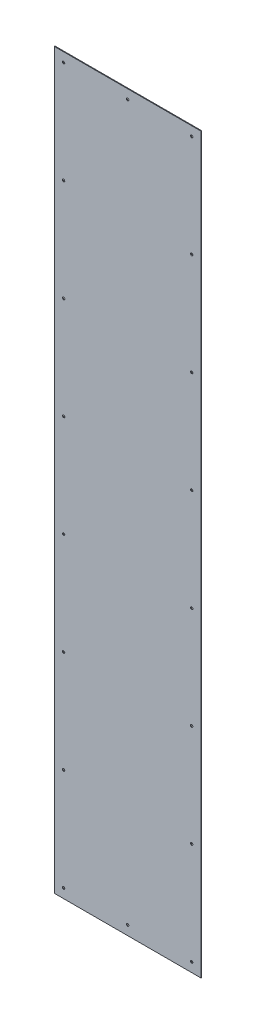
ISO-10303-21;
HEADER;
FILE_DESCRIPTION(('STEP AP214'),'2;1');
FILE_NAME('part.step','',(''),(''),'','','');
FILE_SCHEMA(('AUTOMOTIVE_DESIGN { 1 0 10303 214 1 1 1 1 }'));
ENDSEC;
DATA;
#1=APPLICATION_CONTEXT('core data for automotive mechanical design processes');
#2=APPLICATION_PROTOCOL_DEFINITION('international standard','automotive_design',2000,#1);
#3=PRODUCT_CONTEXT('',#1,'mechanical');
#4=PRODUCT('Part','Part','',(#3));
#5=PRODUCT_RELATED_PRODUCT_CATEGORY('part','',(#4));
#6=PRODUCT_DEFINITION_FORMATION('','',#4);
#7=PRODUCT_DEFINITION_CONTEXT('part definition',#1,'design');
#8=PRODUCT_DEFINITION('design','',#6,#7);
#9=PRODUCT_DEFINITION_SHAPE('','',#8);
#10=(LENGTH_UNIT() NAMED_UNIT(*) SI_UNIT(.MILLI.,.METRE.));
#11=(NAMED_UNIT(*) PLANE_ANGLE_UNIT() SI_UNIT($,.RADIAN.));
#12=(NAMED_UNIT(*) SI_UNIT($,.STERADIAN.) SOLID_ANGLE_UNIT());
#13=UNCERTAINTY_MEASURE_WITH_UNIT(LENGTH_MEASURE(1.E-05),#10,'distance_accuracy_value','');
#14=(GEOMETRIC_REPRESENTATION_CONTEXT(3) GLOBAL_UNCERTAINTY_ASSIGNED_CONTEXT((#13)) GLOBAL_UNIT_ASSIGNED_CONTEXT((#10,
#11,#12)) REPRESENTATION_CONTEXT('',''));
#15=CARTESIAN_POINT('',(0.,0.,0.));
#16=DIRECTION('',(0.,0.,1.));
#17=DIRECTION('',(1.,0.,0.));
#18=AXIS2_PLACEMENT_3D('',#15,#16,#17);
#19=CARTESIAN_POINT('',(0.,0.,1.9));
#20=DIRECTION('',(0.,0.,1.));
#21=DIRECTION('',(1.,0.,0.));
#22=AXIS2_PLACEMENT_3D('',#19,#20,#21);
#23=PLANE('',#22);
#24=CARTESIAN_POINT('',(174.599999999992,417.7,1.9));
#25=DIRECTION('',(0.,0.,1.));
#26=DIRECTION('',(1.,0.,0.));
#27=AXIS2_PLACEMENT_3D('',#24,#25,#26);
#28=CIRCLE('',#27,3.175);
#29=CARTESIAN_POINT('',(177.774999999992,417.7,1.9));
#30=VERTEX_POINT('',#29);
#31=EDGE_CURVE('E201',#30,#30,#28,.F.);
#32=ORIENTED_EDGE('',*,*,#31,.T.);
#33=EDGE_LOOP('',(#32));
#34=FACE_BOUND('',#33,.T.);
#35=CARTESIAN_POINT('',(174.599999999985,-139.2,1.9));
#36=DIRECTION('',(0.,0.,1.));
#37=DIRECTION('',(1.,0.,0.));
#38=AXIS2_PLACEMENT_3D('',#35,#36,#37);
#39=CIRCLE('',#38,3.175);
#40=CARTESIAN_POINT('',(177.774999999985,-139.2,1.9));
#41=VERTEX_POINT('',#40);
#42=EDGE_CURVE('E207',#41,#41,#39,.F.);
#43=ORIENTED_EDGE('',*,*,#42,.T.);
#44=EDGE_LOOP('',(#43));
#45=FACE_BOUND('',#44,.T.);
#46=CARTESIAN_POINT('',(174.599999999977,-696.1,1.9));
#47=DIRECTION('',(0.,0.,1.));
#48=DIRECTION('',(1.,0.,0.));
#49=AXIS2_PLACEMENT_3D('',#46,#47,#48);
#50=CIRCLE('',#49,3.175);
#51=CARTESIAN_POINT('',(177.774999999977,-696.1,1.9));
#52=VERTEX_POINT('',#51);
#53=EDGE_CURVE('E213',#52,#52,#50,.F.);
#54=ORIENTED_EDGE('',*,*,#53,.T.);
#55=EDGE_LOOP('',(#54));
#56=FACE_BOUND('',#55,.T.);
#57=CARTESIAN_POINT('',(0.,-974.6,1.9));
#58=DIRECTION('',(0.,0.,1.));
#59=DIRECTION('',(1.,0.,0.));
#60=AXIS2_PLACEMENT_3D('',#57,#58,#59);
#61=CIRCLE('',#60,3.175);
#62=CARTESIAN_POINT('',(3.175,-974.6,1.9));
#63=VERTEX_POINT('',#62);
#64=EDGE_CURVE('E219',#63,#63,#61,.F.);
#65=ORIENTED_EDGE('',*,*,#64,.T.);
#66=EDGE_LOOP('',(#65));
#67=FACE_BOUND('',#66,.T.);
#68=DIRECTION('',(0.,1.,0.));
#69=VECTOR('',#68,1.);
#70=CARTESIAN_POINT('',(200.,1000.,1.9));
#71=LINE('',#70,#69);
#72=CARTESIAN_POINT('',(200.,-1000.,1.9));
#73=VERTEX_POINT('',#72);
#74=CARTESIAN_POINT('',(200.,1000.,1.9));
#75=VERTEX_POINT('',#74);
#76=EDGE_CURVE('E92',#73,#75,#71,.T.);
#77=ORIENTED_EDGE('',*,*,#76,.T.);
#78=DIRECTION('',(-1.,0.,0.));
#79=VECTOR('',#78,1.);
#80=CARTESIAN_POINT('',(-200.,1000.,1.9));
#81=LINE('',#80,#79);
#82=CARTESIAN_POINT('',(-200.,1000.,1.9));
#83=VERTEX_POINT('',#82);
#84=EDGE_CURVE('E87',#75,#83,#81,.T.);
#85=ORIENTED_EDGE('',*,*,#84,.T.);
#86=DIRECTION('',(0.,-1.,0.));
#87=VECTOR('',#86,1.);
#88=CARTESIAN_POINT('',(-200.,1000.,1.9));
#89=LINE('',#88,#87);
#90=CARTESIAN_POINT('',(-200.,-1000.,1.9));
#91=VERTEX_POINT('',#90);
#92=EDGE_CURVE('E90',#83,#91,#89,.T.);
#93=ORIENTED_EDGE('',*,*,#92,.T.);
#94=DIRECTION('',(1.,0.,0.));
#95=VECTOR('',#94,1.);
#96=CARTESIAN_POINT('',(-200.,-1000.,1.9));
#97=LINE('',#96,#95);
#98=EDGE_CURVE('E57',#91,#73,#97,.T.);
#99=ORIENTED_EDGE('',*,*,#98,.T.);
#100=EDGE_LOOP('',(#77,#85,#93,#99));
#101=FACE_BOUND('',#100,.T.);
#102=CARTESIAN_POINT('',(-174.6,974.6,1.9));
#103=DIRECTION('',(0.,0.,1.));
#104=DIRECTION('',(1.,0.,0.));
#105=AXIS2_PLACEMENT_3D('',#102,#103,#104);
#106=CIRCLE('',#105,3.175);
#107=CARTESIAN_POINT('',(-171.425,974.6,1.9));
#108=VERTEX_POINT('',#107);
#109=EDGE_CURVE('E116',#108,#108,#106,.T.);
#110=ORIENTED_EDGE('',*,*,#109,.F.);
#111=EDGE_LOOP('',(#110));
#112=FACE_BOUND('',#111,.T.);
#113=CARTESIAN_POINT('',(0.,974.6,1.9));
#114=DIRECTION('',(0.,0.,1.));
#115=DIRECTION('',(1.,0.,0.));
#116=AXIS2_PLACEMENT_3D('',#113,#114,#115);
#117=CIRCLE('',#116,3.175);
#118=CARTESIAN_POINT('',(3.175,974.6,1.9));
#119=VERTEX_POINT('',#118);
#120=EDGE_CURVE('E121',#119,#119,#117,.T.);
#121=ORIENTED_EDGE('',*,*,#120,.F.);
#122=EDGE_LOOP('',(#121));
#123=FACE_BOUND('',#122,.T.);
#124=CARTESIAN_POINT('',(174.6,974.6,1.9));
#125=DIRECTION('',(0.,0.,1.));
#126=DIRECTION('',(1.,0.,0.));
#127=AXIS2_PLACEMENT_3D('',#124,#125,#126);
#128=CIRCLE('',#127,3.175);
#129=CARTESIAN_POINT('',(177.775,974.6,1.9));
#130=VERTEX_POINT('',#129);
#131=EDGE_CURVE('E193',#130,#130,#128,.T.);
#132=ORIENTED_EDGE('',*,*,#131,.F.);
#133=EDGE_LOOP('',(#132));
#134=FACE_BOUND('',#133,.T.);
#135=CARTESIAN_POINT('',(-174.599999999996,696.15,1.9));
#136=DIRECTION('',(0.,0.,1.));
#137=DIRECTION('',(1.,0.,0.));
#138=AXIS2_PLACEMENT_3D('',#135,#136,#137);
#139=CIRCLE('',#138,3.175);
#140=CARTESIAN_POINT('',(-171.424999999996,696.15,1.9));
#141=VERTEX_POINT('',#140);
#142=EDGE_CURVE('E190',#141,#141,#139,.T.);
#143=ORIENTED_EDGE('',*,*,#142,.F.);
#144=EDGE_LOOP('',(#143));
#145=FACE_BOUND('',#144,.T.);
#146=CARTESIAN_POINT('',(-174.599999999992,417.7,1.9));
#147=DIRECTION('',(0.,0.,1.));
#148=DIRECTION('',(1.,0.,0.));
#149=AXIS2_PLACEMENT_3D('',#146,#147,#148);
#150=CIRCLE('',#149,3.175);
#151=CARTESIAN_POINT('',(-171.424999999992,417.7,1.9));
#152=VERTEX_POINT('',#151);
#153=EDGE_CURVE('E187',#152,#152,#150,.T.);
#154=ORIENTED_EDGE('',*,*,#153,.F.);
#155=EDGE_LOOP('',(#154));
#156=FACE_BOUND('',#155,.T.);
#157=CARTESIAN_POINT('',(-174.599999999988,139.25,1.9));
#158=DIRECTION('',(0.,0.,1.));
#159=DIRECTION('',(1.,0.,0.));
#160=AXIS2_PLACEMENT_3D('',#157,#158,#159);
#161=CIRCLE('',#160,3.175);
#162=CARTESIAN_POINT('',(-171.424999999988,139.25,1.9));
#163=VERTEX_POINT('',#162);
#164=EDGE_CURVE('E184',#163,#163,#161,.T.);
#165=ORIENTED_EDGE('',*,*,#164,.F.);
#166=EDGE_LOOP('',(#165));
#167=FACE_BOUND('',#166,.T.);
#168=CARTESIAN_POINT('',(-174.599999999985,-139.2,1.9));
#169=DIRECTION('',(0.,0.,1.));
#170=DIRECTION('',(1.,0.,0.));
#171=AXIS2_PLACEMENT_3D('',#168,#169,#170);
#172=CIRCLE('',#171,3.175);
#173=CARTESIAN_POINT('',(-171.424999999984,-139.2,1.9));
#174=VERTEX_POINT('',#173);
#175=EDGE_CURVE('E181',#174,#174,#172,.T.);
#176=ORIENTED_EDGE('',*,*,#175,.F.);
#177=EDGE_LOOP('',(#176));
#178=FACE_BOUND('',#177,.T.);
#179=CARTESIAN_POINT('',(-174.599999999981,-417.65,1.9));
#180=DIRECTION('',(0.,0.,1.));
#181=DIRECTION('',(1.,0.,0.));
#182=AXIS2_PLACEMENT_3D('',#179,#180,#181);
#183=CIRCLE('',#182,3.175);
#184=CARTESIAN_POINT('',(-171.424999999981,-417.65,1.9));
#185=VERTEX_POINT('',#184);
#186=EDGE_CURVE('E177',#185,#185,#183,.T.);
#187=ORIENTED_EDGE('',*,*,#186,.F.);
#188=EDGE_LOOP('',(#187));
#189=FACE_BOUND('',#188,.T.);
#190=CARTESIAN_POINT('',(-174.599999999977,-696.1,1.9));
#191=DIRECTION('',(0.,0.,1.));
#192=DIRECTION('',(1.,0.,0.));
#193=AXIS2_PLACEMENT_3D('',#190,#191,#192);
#194=CIRCLE('',#193,3.175);
#195=CARTESIAN_POINT('',(-171.424999999977,-696.1,1.9));
#196=VERTEX_POINT('',#195);
#197=EDGE_CURVE('E174',#196,#196,#194,.T.);
#198=ORIENTED_EDGE('',*,*,#197,.F.);
#199=EDGE_LOOP('',(#198));
#200=FACE_BOUND('',#199,.T.);
#201=CARTESIAN_POINT('',(-174.6,-974.6,1.9));
#202=DIRECTION('',(0.,0.,1.));
#203=DIRECTION('',(1.,0.,0.));
#204=AXIS2_PLACEMENT_3D('',#201,#202,#203);
#205=CIRCLE('',#204,3.17499999999996);
#206=CARTESIAN_POINT('',(-171.425,-974.6,1.9));
#207=VERTEX_POINT('',#206);
#208=EDGE_CURVE('E178',#207,#207,#205,.F.);
#209=ORIENTED_EDGE('',*,*,#208,.T.);
#210=EDGE_LOOP('',(#209));
#211=FACE_BOUND('',#210,.T.);
#212=CARTESIAN_POINT('',(174.6,-974.6,1.9));
#213=DIRECTION('',(0.,0.,1.));
#214=DIRECTION('',(1.,0.,0.));
#215=AXIS2_PLACEMENT_3D('',#212,#213,#214);
#216=CIRCLE('',#215,3.17499999999996);
#217=CARTESIAN_POINT('',(177.775,-974.6,1.9));
#218=VERTEX_POINT('',#217);
#219=EDGE_CURVE('E216',#218,#218,#216,.F.);
#220=ORIENTED_EDGE('',*,*,#219,.T.);
#221=EDGE_LOOP('',(#220));
#222=FACE_BOUND('',#221,.T.);
#223=CARTESIAN_POINT('',(174.599999999981,-417.65,1.9));
#224=DIRECTION('',(0.,0.,1.));
#225=DIRECTION('',(1.,0.,0.));
#226=AXIS2_PLACEMENT_3D('',#223,#224,#225);
#227=CIRCLE('',#226,3.175);
#228=CARTESIAN_POINT('',(177.774999999981,-417.65,1.9));
#229=VERTEX_POINT('',#228);
#230=EDGE_CURVE('E210',#229,#229,#227,.F.);
#231=ORIENTED_EDGE('',*,*,#230,.T.);
#232=EDGE_LOOP('',(#231));
#233=FACE_BOUND('',#232,.T.);
#234=CARTESIAN_POINT('',(174.599999999988,139.25,1.9));
#235=DIRECTION('',(0.,0.,1.));
#236=DIRECTION('',(1.,0.,0.));
#237=AXIS2_PLACEMENT_3D('',#234,#235,#236);
#238=CIRCLE('',#237,3.175);
#239=CARTESIAN_POINT('',(177.774999999988,139.25,1.9));
#240=VERTEX_POINT('',#239);
#241=EDGE_CURVE('E204',#240,#240,#238,.F.);
#242=ORIENTED_EDGE('',*,*,#241,.T.);
#243=EDGE_LOOP('',(#242));
#244=FACE_BOUND('',#243,.T.);
#245=CARTESIAN_POINT('',(174.599999999996,696.15,1.9));
#246=DIRECTION('',(0.,0.,1.));
#247=DIRECTION('',(1.,0.,0.));
#248=AXIS2_PLACEMENT_3D('',#245,#246,#247);
#249=CIRCLE('',#248,3.175);
#250=CARTESIAN_POINT('',(177.774999999996,696.15,1.9));
#251=VERTEX_POINT('',#250);
#252=EDGE_CURVE('E198',#251,#251,#249,.F.);
#253=ORIENTED_EDGE('',*,*,#252,.T.);
#254=EDGE_LOOP('',(#253));
#255=FACE_BOUND('',#254,.T.);
#256=ADVANCED_FACE('F38',(#34,#45,#56,#67,#101,#112,#123,#134,#145,#156,#167,#178,#189,#200,
#211,#222,#233,#244,#255),#23,.T.);
#257=CARTESIAN_POINT('',(0.,0.,0.));
#258=DIRECTION('',(0.,0.,1.));
#259=DIRECTION('',(1.,0.,0.));
#260=AXIS2_PLACEMENT_3D('',#257,#258,#259);
#261=PLANE('',#260);
#262=CARTESIAN_POINT('',(-174.599999999977,-696.1,0.));
#263=DIRECTION('',(0.,0.,1.));
#264=DIRECTION('',(1.,0.,0.));
#265=AXIS2_PLACEMENT_3D('',#262,#263,#264);
#266=CIRCLE('',#265,3.175);
#267=CARTESIAN_POINT('',(-171.424999999977,-696.1,0.));
#268=VERTEX_POINT('',#267);
#269=EDGE_CURVE('E139',#268,#268,#266,.T.);
#270=ORIENTED_EDGE('',*,*,#269,.T.);
#271=EDGE_LOOP('',(#270));
#272=FACE_BOUND('',#271,.T.);
#273=CARTESIAN_POINT('',(-174.599999999981,-417.65,0.));
#274=DIRECTION('',(0.,0.,1.));
#275=DIRECTION('',(1.,0.,0.));
#276=AXIS2_PLACEMENT_3D('',#273,#274,#275);
#277=CIRCLE('',#276,3.175);
#278=CARTESIAN_POINT('',(-171.424999999981,-417.65,0.));
#279=VERTEX_POINT('',#278);
#280=EDGE_CURVE('E136',#279,#279,#277,.T.);
#281=ORIENTED_EDGE('',*,*,#280,.T.);
#282=EDGE_LOOP('',(#281));
#283=FACE_BOUND('',#282,.T.);
#284=CARTESIAN_POINT('',(-174.599999999985,-139.2,0.));
#285=DIRECTION('',(0.,0.,1.));
#286=DIRECTION('',(1.,0.,0.));
#287=AXIS2_PLACEMENT_3D('',#284,#285,#286);
#288=CIRCLE('',#287,3.175);
#289=CARTESIAN_POINT('',(-171.424999999984,-139.2,0.));
#290=VERTEX_POINT('',#289);
#291=EDGE_CURVE('E133',#290,#290,#288,.T.);
#292=ORIENTED_EDGE('',*,*,#291,.T.);
#293=EDGE_LOOP('',(#292));
#294=FACE_BOUND('',#293,.T.);
#295=CARTESIAN_POINT('',(-174.599999999988,139.25,0.));
#296=DIRECTION('',(0.,0.,1.));
#297=DIRECTION('',(1.,0.,0.));
#298=AXIS2_PLACEMENT_3D('',#295,#296,#297);
#299=CIRCLE('',#298,3.175);
#300=CARTESIAN_POINT('',(-171.424999999988,139.25,0.));
#301=VERTEX_POINT('',#300);
#302=EDGE_CURVE('E130',#301,#301,#299,.T.);
#303=ORIENTED_EDGE('',*,*,#302,.T.);
#304=EDGE_LOOP('',(#303));
#305=FACE_BOUND('',#304,.T.);
#306=CARTESIAN_POINT('',(-174.599999999992,417.7,0.));
#307=DIRECTION('',(0.,0.,1.));
#308=DIRECTION('',(1.,0.,0.));
#309=AXIS2_PLACEMENT_3D('',#306,#307,#308);
#310=CIRCLE('',#309,3.175);
#311=CARTESIAN_POINT('',(-171.424999999992,417.7,0.));
#312=VERTEX_POINT('',#311);
#313=EDGE_CURVE('E127',#312,#312,#310,.T.);
#314=ORIENTED_EDGE('',*,*,#313,.T.);
#315=EDGE_LOOP('',(#314));
#316=FACE_BOUND('',#315,.T.);
#317=CARTESIAN_POINT('',(-174.599999999996,696.15,0.));
#318=DIRECTION('',(0.,0.,1.));
#319=DIRECTION('',(1.,0.,0.));
#320=AXIS2_PLACEMENT_3D('',#317,#318,#319);
#321=CIRCLE('',#320,3.175);
#322=CARTESIAN_POINT('',(-171.424999999996,696.15,0.));
#323=VERTEX_POINT('',#322);
#324=EDGE_CURVE('E124',#323,#323,#321,.T.);
#325=ORIENTED_EDGE('',*,*,#324,.T.);
#326=EDGE_LOOP('',(#325));
#327=FACE_BOUND('',#326,.T.);
#328=CARTESIAN_POINT('',(174.6,974.6,0.));
#329=DIRECTION('',(0.,0.,1.));
#330=DIRECTION('',(1.,0.,0.));
#331=AXIS2_PLACEMENT_3D('',#328,#329,#330);
#332=CIRCLE('',#331,3.175);
#333=CARTESIAN_POINT('',(177.775,974.6,0.));
#334=VERTEX_POINT('',#333);
#335=EDGE_CURVE('E120',#334,#334,#332,.T.);
#336=ORIENTED_EDGE('',*,*,#335,.T.);
#337=EDGE_LOOP('',(#336));
#338=FACE_BOUND('',#337,.T.);
#339=CARTESIAN_POINT('',(0.,974.6,0.));
#340=DIRECTION('',(0.,0.,1.));
#341=DIRECTION('',(1.,0.,0.));
#342=AXIS2_PLACEMENT_3D('',#339,#340,#341);
#343=CIRCLE('',#342,3.175);
#344=CARTESIAN_POINT('',(3.175,974.6,0.));
#345=VERTEX_POINT('',#344);
#346=EDGE_CURVE('E117',#345,#345,#343,.T.);
#347=ORIENTED_EDGE('',*,*,#346,.T.);
#348=EDGE_LOOP('',(#347));
#349=FACE_BOUND('',#348,.T.);
#350=CARTESIAN_POINT('',(-174.6,974.6,0.));
#351=DIRECTION('',(0.,0.,1.));
#352=DIRECTION('',(1.,0.,0.));
#353=AXIS2_PLACEMENT_3D('',#350,#351,#352);
#354=CIRCLE('',#353,3.175);
#355=CARTESIAN_POINT('',(-171.425,974.6,0.));
#356=VERTEX_POINT('',#355);
#357=EDGE_CURVE('E108',#356,#356,#354,.T.);
#358=ORIENTED_EDGE('',*,*,#357,.T.);
#359=EDGE_LOOP('',(#358));
#360=FACE_BOUND('',#359,.T.);
#361=DIRECTION('',(0.,1.,0.));
#362=VECTOR('',#361,1.);
#363=CARTESIAN_POINT('',(200.,1000.,0.));
#364=LINE('',#363,#362);
#365=CARTESIAN_POINT('',(200.,-1000.,0.));
#366=VERTEX_POINT('',#365);
#367=CARTESIAN_POINT('',(200.,1000.,0.));
#368=VERTEX_POINT('',#367);
#369=EDGE_CURVE('E105',#366,#368,#364,.T.);
#370=ORIENTED_EDGE('',*,*,#369,.F.);
#371=DIRECTION('',(1.,0.,0.));
#372=VECTOR('',#371,1.);
#373=CARTESIAN_POINT('',(-200.,-1000.,0.));
#374=LINE('',#373,#372);
#375=CARTESIAN_POINT('',(-200.,-1000.,0.));
#376=VERTEX_POINT('',#375);
#377=EDGE_CURVE('E80',#376,#366,#374,.T.);
#378=ORIENTED_EDGE('',*,*,#377,.F.);
#379=DIRECTION('',(0.,-1.,0.));
#380=VECTOR('',#379,1.);
#381=CARTESIAN_POINT('',(-200.,1000.,0.));
#382=LINE('',#381,#380);
#383=CARTESIAN_POINT('',(-200.,1000.,0.));
#384=VERTEX_POINT('',#383);
#385=EDGE_CURVE('E74',#384,#376,#382,.T.);
#386=ORIENTED_EDGE('',*,*,#385,.F.);
#387=DIRECTION('',(-1.,0.,0.));
#388=VECTOR('',#387,1.);
#389=CARTESIAN_POINT('',(-200.,1000.,0.));
#390=LINE('',#389,#388);
#391=EDGE_CURVE('E96',#368,#384,#390,.T.);
#392=ORIENTED_EDGE('',*,*,#391,.F.);
#393=EDGE_LOOP('',(#370,#378,#386,#392));
#394=FACE_BOUND('',#393,.T.);
#395=CARTESIAN_POINT('',(-174.6,-974.6,0.));
#396=DIRECTION('',(0.,0.,1.));
#397=DIRECTION('',(1.,0.,0.));
#398=AXIS2_PLACEMENT_3D('',#395,#396,#397);
#399=CIRCLE('',#398,3.17499999999996);
#400=CARTESIAN_POINT('',(-171.425,-974.6,0.));
#401=VERTEX_POINT('',#400);
#402=EDGE_CURVE('E142',#401,#401,#399,.F.);
#403=ORIENTED_EDGE('',*,*,#402,.F.);
#404=EDGE_LOOP('',(#403));
#405=FACE_BOUND('',#404,.T.);
#406=CARTESIAN_POINT('',(0.,-974.6,0.));
#407=DIRECTION('',(0.,0.,1.));
#408=DIRECTION('',(1.,0.,0.));
#409=AXIS2_PLACEMENT_3D('',#406,#407,#408);
#410=CIRCLE('',#409,3.175);
#411=CARTESIAN_POINT('',(3.175,-974.6,0.));
#412=VERTEX_POINT('',#411);
#413=EDGE_CURVE('E145',#412,#412,#410,.F.);
#414=ORIENTED_EDGE('',*,*,#413,.F.);
#415=EDGE_LOOP('',(#414));
#416=FACE_BOUND('',#415,.T.);
#417=CARTESIAN_POINT('',(174.6,-974.6,0.));
#418=DIRECTION('',(0.,0.,1.));
#419=DIRECTION('',(1.,0.,0.));
#420=AXIS2_PLACEMENT_3D('',#417,#418,#419);
#421=CIRCLE('',#420,3.17499999999996);
#422=CARTESIAN_POINT('',(177.775,-974.6,0.));
#423=VERTEX_POINT('',#422);
#424=EDGE_CURVE('E148',#423,#423,#421,.F.);
#425=ORIENTED_EDGE('',*,*,#424,.F.);
#426=EDGE_LOOP('',(#425));
#427=FACE_BOUND('',#426,.T.);
#428=CARTESIAN_POINT('',(174.599999999977,-696.1,0.));
#429=DIRECTION('',(0.,0.,1.));
#430=DIRECTION('',(1.,0.,0.));
#431=AXIS2_PLACEMENT_3D('',#428,#429,#430);
#432=CIRCLE('',#431,3.175);
#433=CARTESIAN_POINT('',(177.774999999977,-696.1,0.));
#434=VERTEX_POINT('',#433);
#435=EDGE_CURVE('E151',#434,#434,#432,.F.);
#436=ORIENTED_EDGE('',*,*,#435,.F.);
#437=EDGE_LOOP('',(#436));
#438=FACE_BOUND('',#437,.T.);
#439=CARTESIAN_POINT('',(174.599999999981,-417.65,0.));
#440=DIRECTION('',(0.,0.,1.));
#441=DIRECTION('',(1.,0.,0.));
#442=AXIS2_PLACEMENT_3D('',#439,#440,#441);
#443=CIRCLE('',#442,3.175);
#444=CARTESIAN_POINT('',(177.774999999981,-417.65,0.));
#445=VERTEX_POINT('',#444);
#446=EDGE_CURVE('E154',#445,#445,#443,.F.);
#447=ORIENTED_EDGE('',*,*,#446,.F.);
#448=EDGE_LOOP('',(#447));
#449=FACE_BOUND('',#448,.T.);
#450=CARTESIAN_POINT('',(174.599999999985,-139.2,0.));
#451=DIRECTION('',(0.,0.,1.));
#452=DIRECTION('',(1.,0.,0.));
#453=AXIS2_PLACEMENT_3D('',#450,#451,#452);
#454=CIRCLE('',#453,3.175);
#455=CARTESIAN_POINT('',(177.774999999985,-139.2,0.));
#456=VERTEX_POINT('',#455);
#457=EDGE_CURVE('E157',#456,#456,#454,.F.);
#458=ORIENTED_EDGE('',*,*,#457,.F.);
#459=EDGE_LOOP('',(#458));
#460=FACE_BOUND('',#459,.T.);
#461=CARTESIAN_POINT('',(174.599999999988,139.25,0.));
#462=DIRECTION('',(0.,0.,1.));
#463=DIRECTION('',(1.,0.,0.));
#464=AXIS2_PLACEMENT_3D('',#461,#462,#463);
#465=CIRCLE('',#464,3.175);
#466=CARTESIAN_POINT('',(177.774999999988,139.25,0.));
#467=VERTEX_POINT('',#466);
#468=EDGE_CURVE('E160',#467,#467,#465,.F.);
#469=ORIENTED_EDGE('',*,*,#468,.F.);
#470=EDGE_LOOP('',(#469));
#471=FACE_BOUND('',#470,.T.);
#472=CARTESIAN_POINT('',(174.599999999992,417.7,0.));
#473=DIRECTION('',(0.,0.,1.));
#474=DIRECTION('',(1.,0.,0.));
#475=AXIS2_PLACEMENT_3D('',#472,#473,#474);
#476=CIRCLE('',#475,3.175);
#477=CARTESIAN_POINT('',(177.774999999992,417.7,0.));
#478=VERTEX_POINT('',#477);
#479=EDGE_CURVE('E162',#478,#478,#476,.F.);
#480=ORIENTED_EDGE('',*,*,#479,.F.);
#481=EDGE_LOOP('',(#480));
#482=FACE_BOUND('',#481,.T.);
#483=CARTESIAN_POINT('',(174.599999999996,696.15,0.));
#484=DIRECTION('',(0.,0.,1.));
#485=DIRECTION('',(1.,0.,0.));
#486=AXIS2_PLACEMENT_3D('',#483,#484,#485);
#487=CIRCLE('',#486,3.175);
#488=CARTESIAN_POINT('',(177.774999999996,696.15,0.));
#489=VERTEX_POINT('',#488);
#490=EDGE_CURVE('E42',#489,#489,#487,.F.);
#491=ORIENTED_EDGE('',*,*,#490,.F.);
#492=EDGE_LOOP('',(#491));
#493=FACE_BOUND('',#492,.T.);
#494=ADVANCED_FACE('F235',(#272,#283,#294,#305,#316,#327,#338,#349,#360,#394,#405,#416,#427,
#438,#449,#460,#471,#482,#493),#261,.F.);
#495=CARTESIAN_POINT('',(200.,1000.,1.9));
#496=DIRECTION('',(-1.,0.,0.));
#497=DIRECTION('',(0.,-1.,0.));
#498=AXIS2_PLACEMENT_3D('',#495,#496,#497);
#499=PLANE('',#498);
#500=ORIENTED_EDGE('',*,*,#369,.T.);
#501=DIRECTION('',(0.,0.,-1.));
#502=VECTOR('',#501,1.);
#503=CARTESIAN_POINT('',(200.,1000.,1.9));
#504=LINE('',#503,#502);
#505=EDGE_CURVE('E11',#75,#368,#504,.T.);
#506=ORIENTED_EDGE('',*,*,#505,.F.);
#507=ORIENTED_EDGE('',*,*,#76,.F.);
#508=DIRECTION('',(0.,0.,-1.));
#509=VECTOR('',#508,1.);
#510=CARTESIAN_POINT('',(200.,-1000.,1.9));
#511=LINE('',#510,#509);
#512=EDGE_CURVE('E101',#73,#366,#511,.T.);
#513=ORIENTED_EDGE('',*,*,#512,.T.);
#514=EDGE_LOOP('',(#500,#506,#507,#513));
#515=FACE_BOUND('',#514,.T.);
#516=ADVANCED_FACE('F40',(#515),#499,.F.);
#517=CARTESIAN_POINT('',(-200.,1000.,1.9));
#518=DIRECTION('',(0.,-1.,0.));
#519=DIRECTION('',(0.,0.,-1.));
#520=AXIS2_PLACEMENT_3D('',#517,#518,#519);
#521=PLANE('',#520);
#522=ORIENTED_EDGE('',*,*,#391,.T.);
#523=DIRECTION('',(0.,0.,-1.));
#524=VECTOR('',#523,1.);
#525=CARTESIAN_POINT('',(-200.,1000.,1.9));
#526=LINE('',#525,#524);
#527=EDGE_CURVE('E48',#83,#384,#526,.T.);
#528=ORIENTED_EDGE('',*,*,#527,.F.);
#529=ORIENTED_EDGE('',*,*,#84,.F.);
#530=ORIENTED_EDGE('',*,*,#505,.T.);
#531=EDGE_LOOP('',(#522,#528,#529,#530));
#532=FACE_BOUND('',#531,.T.);
#533=ADVANCED_FACE('F95',(#532),#521,.F.);
#534=CARTESIAN_POINT('',(-200.,1000.,1.9));
#535=DIRECTION('',(1.,0.,0.));
#536=DIRECTION('',(0.,1.,0.));
#537=AXIS2_PLACEMENT_3D('',#534,#535,#536);
#538=PLANE('',#537);
#539=ORIENTED_EDGE('',*,*,#385,.T.);
#540=DIRECTION('',(0.,0.,-1.));
#541=VECTOR('',#540,1.);
#542=CARTESIAN_POINT('',(-200.,-1000.,1.9));
#543=LINE('',#542,#541);
#544=EDGE_CURVE('E97',#91,#376,#543,.T.);
#545=ORIENTED_EDGE('',*,*,#544,.F.);
#546=ORIENTED_EDGE('',*,*,#92,.F.);
#547=ORIENTED_EDGE('',*,*,#527,.T.);
#548=EDGE_LOOP('',(#539,#545,#546,#547));
#549=FACE_BOUND('',#548,.T.);
#550=ADVANCED_FACE('F99',(#549),#538,.F.);
#551=CARTESIAN_POINT('',(-200.,-1000.,1.9));
#552=DIRECTION('',(0.,1.,0.));
#553=DIRECTION('',(0.,0.,1.));
#554=AXIS2_PLACEMENT_3D('',#551,#552,#553);
#555=PLANE('',#554);
#556=ORIENTED_EDGE('',*,*,#377,.T.);
#557=ORIENTED_EDGE('',*,*,#512,.F.);
#558=ORIENTED_EDGE('',*,*,#98,.F.);
#559=ORIENTED_EDGE('',*,*,#544,.T.);
#560=EDGE_LOOP('',(#556,#557,#558,#559));
#561=FACE_BOUND('',#560,.T.);
#562=ADVANCED_FACE('F281',(#561),#555,.F.);
#563=CARTESIAN_POINT('',(-174.6,974.6,-8.1));
#564=DIRECTION('',(0.,0.,1.));
#565=DIRECTION('',(1.,0.,0.));
#566=AXIS2_PLACEMENT_3D('',#563,#564,#565);
#567=CYLINDRICAL_SURFACE('',#566,3.175);
#568=ORIENTED_EDGE('',*,*,#109,.T.);
#569=EDGE_LOOP('',(#568));
#570=FACE_BOUND('',#569,.T.);
#571=ORIENTED_EDGE('',*,*,#357,.F.);
#572=EDGE_LOOP('',(#571));
#573=FACE_BOUND('',#572,.T.);
#574=ADVANCED_FACE('F278',(#570,#573),#567,.F.);
#575=CARTESIAN_POINT('',(0.,974.6,-8.1));
#576=DIRECTION('',(0.,0.,1.));
#577=DIRECTION('',(1.,0.,0.));
#578=AXIS2_PLACEMENT_3D('',#575,#576,#577);
#579=CYLINDRICAL_SURFACE('',#578,3.175);
#580=ORIENTED_EDGE('',*,*,#120,.T.);
#581=EDGE_LOOP('',(#580));
#582=FACE_BOUND('',#581,.T.);
#583=ORIENTED_EDGE('',*,*,#346,.F.);
#584=EDGE_LOOP('',(#583));
#585=FACE_BOUND('',#584,.T.);
#586=ADVANCED_FACE('F321',(#582,#585),#579,.F.);
#587=CARTESIAN_POINT('',(174.6,974.6,-8.1));
#588=DIRECTION('',(0.,0.,1.));
#589=DIRECTION('',(1.,0.,0.));
#590=AXIS2_PLACEMENT_3D('',#587,#588,#589);
#591=CYLINDRICAL_SURFACE('',#590,3.175);
#592=ORIENTED_EDGE('',*,*,#131,.T.);
#593=EDGE_LOOP('',(#592));
#594=FACE_BOUND('',#593,.T.);
#595=ORIENTED_EDGE('',*,*,#335,.F.);
#596=EDGE_LOOP('',(#595));
#597=FACE_BOUND('',#596,.T.);
#598=ADVANCED_FACE('F329',(#594,#597),#591,.F.);
#599=CARTESIAN_POINT('',(-174.599999999996,696.15,-8.1));
#600=DIRECTION('',(0.,0.,1.));
#601=DIRECTION('',(1.,0.,0.));
#602=AXIS2_PLACEMENT_3D('',#599,#600,#601);
#603=CYLINDRICAL_SURFACE('',#602,3.175);
#604=ORIENTED_EDGE('',*,*,#142,.T.);
#605=EDGE_LOOP('',(#604));
#606=FACE_BOUND('',#605,.T.);
#607=ORIENTED_EDGE('',*,*,#324,.F.);
#608=EDGE_LOOP('',(#607));
#609=FACE_BOUND('',#608,.T.);
#610=ADVANCED_FACE('F340',(#606,#609),#603,.F.);
#611=CARTESIAN_POINT('',(-174.599999999992,417.7,-8.1));
#612=DIRECTION('',(0.,0.,1.));
#613=DIRECTION('',(1.,0.,0.));
#614=AXIS2_PLACEMENT_3D('',#611,#612,#613);
#615=CYLINDRICAL_SURFACE('',#614,3.175);
#616=ORIENTED_EDGE('',*,*,#153,.T.);
#617=EDGE_LOOP('',(#616));
#618=FACE_BOUND('',#617,.T.);
#619=ORIENTED_EDGE('',*,*,#313,.F.);
#620=EDGE_LOOP('',(#619));
#621=FACE_BOUND('',#620,.T.);
#622=ADVANCED_FACE('F350',(#618,#621),#615,.F.);
#623=CARTESIAN_POINT('',(-174.599999999988,139.25,-8.1));
#624=DIRECTION('',(0.,0.,1.));
#625=DIRECTION('',(1.,0.,0.));
#626=AXIS2_PLACEMENT_3D('',#623,#624,#625);
#627=CYLINDRICAL_SURFACE('',#626,3.175);
#628=ORIENTED_EDGE('',*,*,#164,.T.);
#629=EDGE_LOOP('',(#628));
#630=FACE_BOUND('',#629,.T.);
#631=ORIENTED_EDGE('',*,*,#302,.F.);
#632=EDGE_LOOP('',(#631));
#633=FACE_BOUND('',#632,.T.);
#634=ADVANCED_FACE('F360',(#630,#633),#627,.F.);
#635=CARTESIAN_POINT('',(-174.599999999985,-139.2,-8.1));
#636=DIRECTION('',(0.,0.,1.));
#637=DIRECTION('',(1.,0.,0.));
#638=AXIS2_PLACEMENT_3D('',#635,#636,#637);
#639=CYLINDRICAL_SURFACE('',#638,3.175);
#640=ORIENTED_EDGE('',*,*,#175,.T.);
#641=EDGE_LOOP('',(#640));
#642=FACE_BOUND('',#641,.T.);
#643=ORIENTED_EDGE('',*,*,#291,.F.);
#644=EDGE_LOOP('',(#643));
#645=FACE_BOUND('',#644,.T.);
#646=ADVANCED_FACE('F370',(#642,#645),#639,.F.);
#647=CARTESIAN_POINT('',(-174.599999999981,-417.65,-8.1));
#648=DIRECTION('',(0.,0.,1.));
#649=DIRECTION('',(1.,0.,0.));
#650=AXIS2_PLACEMENT_3D('',#647,#648,#649);
#651=CYLINDRICAL_SURFACE('',#650,3.175);
#652=ORIENTED_EDGE('',*,*,#186,.T.);
#653=EDGE_LOOP('',(#652));
#654=FACE_BOUND('',#653,.T.);
#655=ORIENTED_EDGE('',*,*,#280,.F.);
#656=EDGE_LOOP('',(#655));
#657=FACE_BOUND('',#656,.T.);
#658=ADVANCED_FACE('F380',(#654,#657),#651,.F.);
#659=CARTESIAN_POINT('',(-174.599999999977,-696.1,-8.1));
#660=DIRECTION('',(0.,0.,1.));
#661=DIRECTION('',(1.,0.,0.));
#662=AXIS2_PLACEMENT_3D('',#659,#660,#661);
#663=CYLINDRICAL_SURFACE('',#662,3.175);
#664=ORIENTED_EDGE('',*,*,#197,.T.);
#665=EDGE_LOOP('',(#664));
#666=FACE_BOUND('',#665,.T.);
#667=ORIENTED_EDGE('',*,*,#269,.F.);
#668=EDGE_LOOP('',(#667));
#669=FACE_BOUND('',#668,.T.);
#670=ADVANCED_FACE('F231',(#666,#669),#663,.F.);
#671=CARTESIAN_POINT('',(-174.6,-974.6,-8.1));
#672=DIRECTION('',(0.,0.,1.));
#673=DIRECTION('',(1.,0.,0.));
#674=AXIS2_PLACEMENT_3D('',#671,#672,#673);
#675=CYLINDRICAL_SURFACE('',#674,3.17499999999996);
#676=ORIENTED_EDGE('',*,*,#208,.F.);
#677=EDGE_LOOP('',(#676));
#678=FACE_BOUND('',#677,.T.);
#679=ORIENTED_EDGE('',*,*,#402,.T.);
#680=EDGE_LOOP('',(#679));
#681=FACE_BOUND('',#680,.T.);
#682=ADVANCED_FACE('F227',(#678,#681),#675,.F.);
#683=CARTESIAN_POINT('',(0.,-974.6,-8.1));
#684=DIRECTION('',(0.,0.,1.));
#685=DIRECTION('',(1.,0.,0.));
#686=AXIS2_PLACEMENT_3D('',#683,#684,#685);
#687=CYLINDRICAL_SURFACE('',#686,3.175);
#688=ORIENTED_EDGE('',*,*,#64,.F.);
#689=EDGE_LOOP('',(#688));
#690=FACE_BOUND('',#689,.T.);
#691=ORIENTED_EDGE('',*,*,#413,.T.);
#692=EDGE_LOOP('',(#691));
#693=FACE_BOUND('',#692,.T.);
#694=ADVANCED_FACE('F230',(#690,#693),#687,.F.);
#695=CARTESIAN_POINT('',(174.6,-974.6,-8.1));
#696=DIRECTION('',(0.,0.,1.));
#697=DIRECTION('',(1.,0.,0.));
#698=AXIS2_PLACEMENT_3D('',#695,#696,#697);
#699=CYLINDRICAL_SURFACE('',#698,3.17499999999996);
#700=ORIENTED_EDGE('',*,*,#219,.F.);
#701=EDGE_LOOP('',(#700));
#702=FACE_BOUND('',#701,.T.);
#703=ORIENTED_EDGE('',*,*,#424,.T.);
#704=EDGE_LOOP('',(#703));
#705=FACE_BOUND('',#704,.T.);
#706=ADVANCED_FACE('F413',(#702,#705),#699,.F.);
#707=CARTESIAN_POINT('',(174.599999999977,-696.1,-8.1));
#708=DIRECTION('',(0.,0.,1.));
#709=DIRECTION('',(1.,0.,0.));
#710=AXIS2_PLACEMENT_3D('',#707,#708,#709);
#711=CYLINDRICAL_SURFACE('',#710,3.175);
#712=ORIENTED_EDGE('',*,*,#53,.F.);
#713=EDGE_LOOP('',(#712));
#714=FACE_BOUND('',#713,.T.);
#715=ORIENTED_EDGE('',*,*,#435,.T.);
#716=EDGE_LOOP('',(#715));
#717=FACE_BOUND('',#716,.T.);
#718=ADVANCED_FACE('F423',(#714,#717),#711,.F.);
#719=CARTESIAN_POINT('',(174.599999999981,-417.65,-8.1));
#720=DIRECTION('',(0.,0.,1.));
#721=DIRECTION('',(1.,0.,0.));
#722=AXIS2_PLACEMENT_3D('',#719,#720,#721);
#723=CYLINDRICAL_SURFACE('',#722,3.175);
#724=ORIENTED_EDGE('',*,*,#230,.F.);
#725=EDGE_LOOP('',(#724));
#726=FACE_BOUND('',#725,.T.);
#727=ORIENTED_EDGE('',*,*,#446,.T.);
#728=EDGE_LOOP('',(#727));
#729=FACE_BOUND('',#728,.T.);
#730=ADVANCED_FACE('F267',(#726,#729),#723,.F.);
#731=CARTESIAN_POINT('',(174.599999999985,-139.2,-8.1));
#732=DIRECTION('',(0.,0.,1.));
#733=DIRECTION('',(1.,0.,0.));
#734=AXIS2_PLACEMENT_3D('',#731,#732,#733);
#735=CYLINDRICAL_SURFACE('',#734,3.175);
#736=ORIENTED_EDGE('',*,*,#42,.F.);
#737=EDGE_LOOP('',(#736));
#738=FACE_BOUND('',#737,.T.);
#739=ORIENTED_EDGE('',*,*,#457,.T.);
#740=EDGE_LOOP('',(#739));
#741=FACE_BOUND('',#740,.T.);
#742=ADVANCED_FACE('F257',(#738,#741),#735,.F.);
#743=CARTESIAN_POINT('',(174.599999999988,139.25,-8.1));
#744=DIRECTION('',(0.,0.,1.));
#745=DIRECTION('',(1.,0.,0.));
#746=AXIS2_PLACEMENT_3D('',#743,#744,#745);
#747=CYLINDRICAL_SURFACE('',#746,3.175);
#748=ORIENTED_EDGE('',*,*,#241,.F.);
#749=EDGE_LOOP('',(#748));
#750=FACE_BOUND('',#749,.T.);
#751=ORIENTED_EDGE('',*,*,#468,.T.);
#752=EDGE_LOOP('',(#751));
#753=FACE_BOUND('',#752,.T.);
#754=ADVANCED_FACE('F254',(#750,#753),#747,.F.);
#755=CARTESIAN_POINT('',(174.599999999992,417.7,-8.1));
#756=DIRECTION('',(0.,0.,1.));
#757=DIRECTION('',(1.,0.,0.));
#758=AXIS2_PLACEMENT_3D('',#755,#756,#757);
#759=CYLINDRICAL_SURFACE('',#758,3.175);
#760=ORIENTED_EDGE('',*,*,#31,.F.);
#761=EDGE_LOOP('',(#760));
#762=FACE_BOUND('',#761,.T.);
#763=ORIENTED_EDGE('',*,*,#479,.T.);
#764=EDGE_LOOP('',(#763));
#765=FACE_BOUND('',#764,.T.);
#766=ADVANCED_FACE('F256',(#762,#765),#759,.F.);
#767=CARTESIAN_POINT('',(174.599999999996,696.15,-8.1));
#768=DIRECTION('',(0.,0.,1.));
#769=DIRECTION('',(1.,0.,0.));
#770=AXIS2_PLACEMENT_3D('',#767,#768,#769);
#771=CYLINDRICAL_SURFACE('',#770,3.175);
#772=ORIENTED_EDGE('',*,*,#252,.F.);
#773=EDGE_LOOP('',(#772));
#774=FACE_BOUND('',#773,.T.);
#775=ORIENTED_EDGE('',*,*,#490,.T.);
#776=EDGE_LOOP('',(#775));
#777=FACE_BOUND('',#776,.T.);
#778=ADVANCED_FACE('F264',(#774,#777),#771,.F.);
#779=CLOSED_SHELL('',(#256,#494,#516,#533,#550,#562,#574,#586,#598,#610,#622,#634,#646,#658,
#670,#682,#694,#706,#718,#730,#742,#754,#766,#778));
#780=MANIFOLD_SOLID_BREP('B2',#779);
#781=ADVANCED_BREP_SHAPE_REPRESENTATION('',(#18,#780),#14);
#782=SHAPE_DEFINITION_REPRESENTATION(#9,#781);
ENDSEC;
END-ISO-10303-21;
